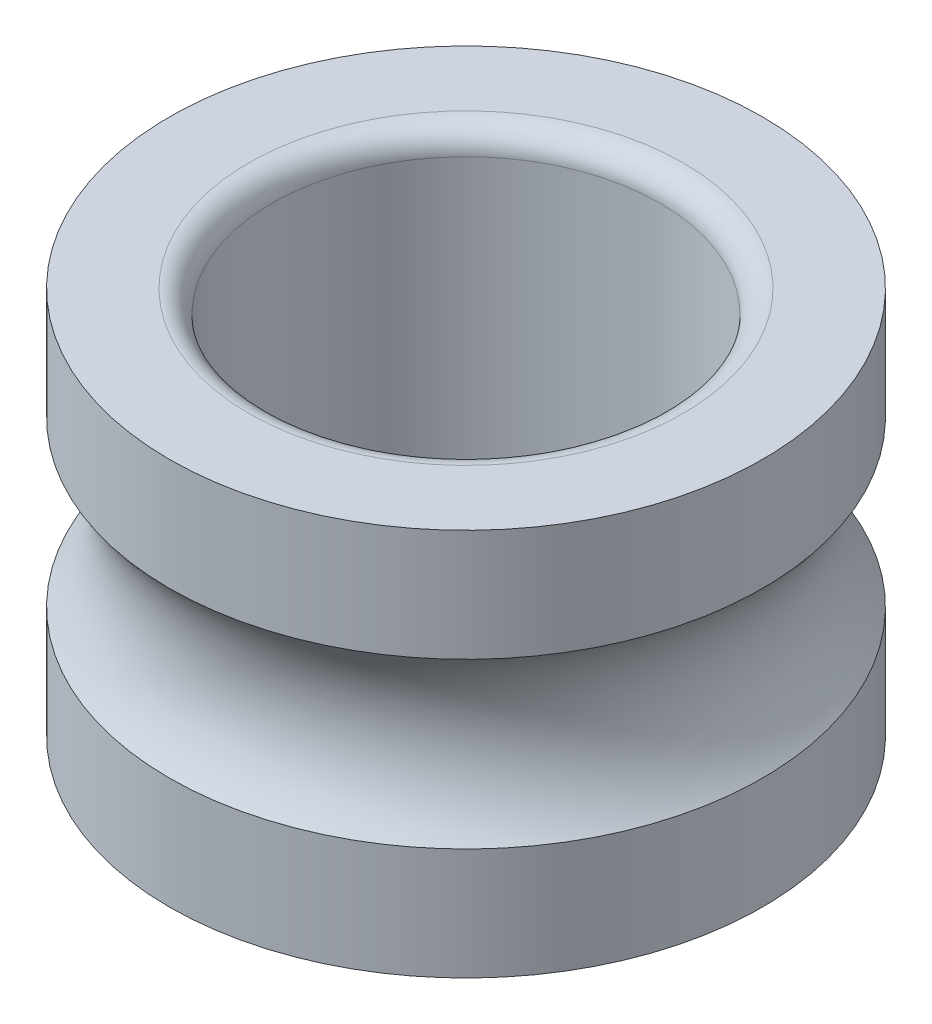
ISO-10303-21;
HEADER;
FILE_DESCRIPTION(('STEP AP214'),'2;1');
FILE_NAME('part.step','',(''),(''),'','','');
FILE_SCHEMA(('AUTOMOTIVE_DESIGN { 1 0 10303 214 1 1 1 1 }'));
ENDSEC;
DATA;
#1=APPLICATION_CONTEXT('core data for automotive mechanical design processes');
#2=APPLICATION_PROTOCOL_DEFINITION('international standard','automotive_design',2000,#1);
#3=PRODUCT_CONTEXT('',#1,'mechanical');
#4=PRODUCT('Part','Part','',(#3));
#5=PRODUCT_RELATED_PRODUCT_CATEGORY('part','',(#4));
#6=PRODUCT_DEFINITION_FORMATION('','',#4);
#7=PRODUCT_DEFINITION_CONTEXT('part definition',#1,'design');
#8=PRODUCT_DEFINITION('design','',#6,#7);
#9=PRODUCT_DEFINITION_SHAPE('','',#8);
#10=(LENGTH_UNIT() NAMED_UNIT(*) SI_UNIT(.MILLI.,.METRE.));
#11=(NAMED_UNIT(*) PLANE_ANGLE_UNIT() SI_UNIT($,.RADIAN.));
#12=(NAMED_UNIT(*) SI_UNIT($,.STERADIAN.) SOLID_ANGLE_UNIT());
#13=UNCERTAINTY_MEASURE_WITH_UNIT(LENGTH_MEASURE(1.E-05),#10,'distance_accuracy_value','');
#14=(GEOMETRIC_REPRESENTATION_CONTEXT(3) GLOBAL_UNCERTAINTY_ASSIGNED_CONTEXT((#13)) GLOBAL_UNIT_ASSIGNED_CONTEXT((#10,
#11,#12)) REPRESENTATION_CONTEXT('',''));
#15=CARTESIAN_POINT('',(0.,0.,0.));
#16=DIRECTION('',(0.,0.,1.));
#17=DIRECTION('',(1.,0.,0.));
#18=AXIS2_PLACEMENT_3D('',#15,#16,#17);
#19=CARTESIAN_POINT('',(0.,-2.5,0.));
#20=DIRECTION('',(0.,1.,0.));
#21=DIRECTION('',(1.,0.,0.));
#22=AXIS2_PLACEMENT_3D('',#19,#20,#21);
#23=PLANE('',#22);
#24=CARTESIAN_POINT('',(0.,-2.5,0.));
#25=DIRECTION('',(0.,1.,0.));
#26=DIRECTION('',(0.,0.,-1.));
#27=AXIS2_PLACEMENT_3D('',#24,#25,#26);
#28=CIRCLE('',#27,2.8);
#29=CARTESIAN_POINT('',(0.,-2.5,-2.8));
#30=VERTEX_POINT('',#29);
#31=EDGE_CURVE('E74',#30,#30,#28,.T.);
#32=ORIENTED_EDGE('',*,*,#31,.T.);
#33=EDGE_LOOP('',(#32));
#34=FACE_BOUND('',#33,.T.);
#35=CARTESIAN_POINT('',(0.,-2.5,0.));
#36=DIRECTION('',(0.,-1.,0.));
#37=DIRECTION('',(0.,0.,-1.));
#38=AXIS2_PLACEMENT_3D('',#35,#36,#37);
#39=CIRCLE('',#38,3.825);
#40=CARTESIAN_POINT('',(0.,-2.5,3.825));
#41=VERTEX_POINT('',#40);
#42=EDGE_CURVE('E11',#41,#41,#39,.T.);
#43=ORIENTED_EDGE('',*,*,#42,.T.);
#44=EDGE_LOOP('',(#43));
#45=FACE_BOUND('',#44,.T.);
#46=ADVANCED_FACE('F17',(#34,#45),#23,.F.);
#47=CARTESIAN_POINT('',(0.,-2.75,0.));
#48=DIRECTION('',(0.,1.,0.));
#49=DIRECTION('',(0.,0.,-1.));
#50=AXIS2_PLACEMENT_3D('',#47,#48,#49);
#51=CYLINDRICAL_SURFACE('',#50,3.825);
#52=CARTESIAN_POINT('',(0.,-1.059174206635,0.));
#53=DIRECTION('',(0.,-1.,0.));
#54=DIRECTION('',(0.,0.,-1.));
#55=AXIS2_PLACEMENT_3D('',#52,#53,#54);
#56=CIRCLE('',#55,3.825);
#57=CARTESIAN_POINT('',(0.,-1.059174206635,-3.825));
#58=VERTEX_POINT('',#57);
#59=EDGE_CURVE('E27',#58,#58,#56,.T.);
#60=ORIENTED_EDGE('',*,*,#59,.T.);
#61=EDGE_LOOP('',(#60));
#62=FACE_BOUND('',#61,.T.);
#63=ORIENTED_EDGE('',*,*,#42,.F.);
#64=EDGE_LOOP('',(#63));
#65=FACE_BOUND('',#64,.T.);
#66=ADVANCED_FACE('F106',(#62,#65),#51,.T.);
#67=CARTESIAN_POINT('',(0.,0.,0.));
#68=DIRECTION('',(0.,1.,0.));
#69=DIRECTION('',(0.,0.,-1.));
#70=AXIS2_PLACEMENT_3D('',#67,#68,#69);
#71=TOROIDAL_SURFACE('',#70,5.0075,1.5875);
#72=ORIENTED_EDGE('',*,*,#59,.F.);
#73=EDGE_LOOP('',(#72));
#74=FACE_BOUND('',#73,.T.);
#75=CARTESIAN_POINT('',(0.,1.059174206635,0.));
#76=DIRECTION('',(0.,-1.,0.));
#77=DIRECTION('',(0.,0.,-1.));
#78=AXIS2_PLACEMENT_3D('',#75,#76,#77);
#79=CIRCLE('',#78,3.825);
#80=CARTESIAN_POINT('',(0.,1.059174206635,3.825));
#81=VERTEX_POINT('',#80);
#82=EDGE_CURVE('E59',#81,#81,#79,.T.);
#83=ORIENTED_EDGE('',*,*,#82,.T.);
#84=EDGE_LOOP('',(#83));
#85=FACE_BOUND('',#84,.T.);
#86=ADVANCED_FACE('F60',(#74,#85),#71,.F.);
#87=CARTESIAN_POINT('',(0.,-2.75,0.));
#88=DIRECTION('',(0.,1.,0.));
#89=DIRECTION('',(0.,0.,-1.));
#90=AXIS2_PLACEMENT_3D('',#87,#88,#89);
#91=CYLINDRICAL_SURFACE('',#90,3.825);
#92=CARTESIAN_POINT('',(0.,2.5,0.));
#93=DIRECTION('',(0.,1.,0.));
#94=DIRECTION('',(0.,0.,-1.));
#95=AXIS2_PLACEMENT_3D('',#92,#93,#94);
#96=CIRCLE('',#95,3.825);
#97=CARTESIAN_POINT('',(0.,2.5,3.825));
#98=VERTEX_POINT('',#97);
#99=EDGE_CURVE('E63',#98,#98,#96,.T.);
#100=ORIENTED_EDGE('',*,*,#99,.F.);
#101=EDGE_LOOP('',(#100));
#102=FACE_BOUND('',#101,.T.);
#103=ORIENTED_EDGE('',*,*,#82,.F.);
#104=EDGE_LOOP('',(#103));
#105=FACE_BOUND('',#104,.T.);
#106=ADVANCED_FACE('F115',(#102,#105),#91,.T.);
#107=CARTESIAN_POINT('',(0.,2.5,0.));
#108=DIRECTION('',(0.,1.,0.));
#109=DIRECTION('',(1.,0.,0.));
#110=AXIS2_PLACEMENT_3D('',#107,#108,#109);
#111=PLANE('',#110);
#112=CARTESIAN_POINT('',(0.,2.5,0.));
#113=DIRECTION('',(0.,-1.,0.));
#114=DIRECTION('',(0.,0.,-1.));
#115=AXIS2_PLACEMENT_3D('',#112,#113,#114);
#116=CIRCLE('',#115,2.8);
#117=CARTESIAN_POINT('',(0.,2.5,2.8));
#118=VERTEX_POINT('',#117);
#119=EDGE_CURVE('E69',#118,#118,#116,.T.);
#120=ORIENTED_EDGE('',*,*,#119,.T.);
#121=EDGE_LOOP('',(#120));
#122=FACE_BOUND('',#121,.T.);
#123=ORIENTED_EDGE('',*,*,#99,.T.);
#124=EDGE_LOOP('',(#123));
#125=FACE_BOUND('',#124,.T.);
#126=ADVANCED_FACE('F101',(#122,#125),#111,.T.);
#127=CARTESIAN_POINT('',(0.,2.2,0.));
#128=DIRECTION('',(0.,1.,0.));
#129=DIRECTION('',(0.,0.,-1.));
#130=AXIS2_PLACEMENT_3D('',#127,#128,#129);
#131=TOROIDAL_SURFACE('',#130,2.8,0.3);
#132=CARTESIAN_POINT('',(0.,2.2,0.));
#133=DIRECTION('',(0.,-1.,0.));
#134=DIRECTION('',(0.,0.,-1.));
#135=AXIS2_PLACEMENT_3D('',#132,#133,#134);
#136=CIRCLE('',#135,2.5);
#137=CARTESIAN_POINT('',(0.,2.2,-2.5));
#138=VERTEX_POINT('',#137);
#139=EDGE_CURVE('E72',#138,#138,#136,.T.);
#140=ORIENTED_EDGE('',*,*,#139,.T.);
#141=EDGE_LOOP('',(#140));
#142=FACE_BOUND('',#141,.T.);
#143=ORIENTED_EDGE('',*,*,#119,.F.);
#144=EDGE_LOOP('',(#143));
#145=FACE_BOUND('',#144,.T.);
#146=ADVANCED_FACE('F19',(#142,#145),#131,.T.);
#147=CARTESIAN_POINT('',(0.,-2.75,0.));
#148=DIRECTION('',(0.,1.,0.));
#149=DIRECTION('',(0.,0.,-1.));
#150=AXIS2_PLACEMENT_3D('',#147,#148,#149);
#151=CYLINDRICAL_SURFACE('',#150,2.5);
#152=ORIENTED_EDGE('',*,*,#139,.F.);
#153=EDGE_LOOP('',(#152));
#154=FACE_BOUND('',#153,.T.);
#155=CARTESIAN_POINT('',(0.,-2.2,0.));
#156=DIRECTION('',(0.,-1.,0.));
#157=DIRECTION('',(0.,0.,-1.));
#158=AXIS2_PLACEMENT_3D('',#155,#156,#157);
#159=CIRCLE('',#158,2.5);
#160=CARTESIAN_POINT('',(0.,-2.2,2.5));
#161=VERTEX_POINT('',#160);
#162=EDGE_CURVE('E75',#161,#161,#159,.T.);
#163=ORIENTED_EDGE('',*,*,#162,.T.);
#164=EDGE_LOOP('',(#163));
#165=FACE_BOUND('',#164,.T.);
#166=ADVANCED_FACE('F90',(#154,#165),#151,.F.);
#167=CARTESIAN_POINT('',(0.,-2.2,0.));
#168=DIRECTION('',(0.,1.,0.));
#169=DIRECTION('',(0.,0.,-1.));
#170=AXIS2_PLACEMENT_3D('',#167,#168,#169);
#171=TOROIDAL_SURFACE('',#170,2.8,0.3);
#172=ORIENTED_EDGE('',*,*,#31,.F.);
#173=EDGE_LOOP('',(#172));
#174=FACE_BOUND('',#173,.T.);
#175=ORIENTED_EDGE('',*,*,#162,.F.);
#176=EDGE_LOOP('',(#175));
#177=FACE_BOUND('',#176,.T.);
#178=ADVANCED_FACE('F87',(#174,#177),#171,.T.);
#179=CLOSED_SHELL('',(#46,#66,#86,#106,#126,#146,#166,#178));
#180=MANIFOLD_SOLID_BREP('B1',#179);
#181=ADVANCED_BREP_SHAPE_REPRESENTATION('',(#18,#180),#14);
#182=SHAPE_DEFINITION_REPRESENTATION(#9,#181);
ENDSEC;
END-ISO-10303-21;
